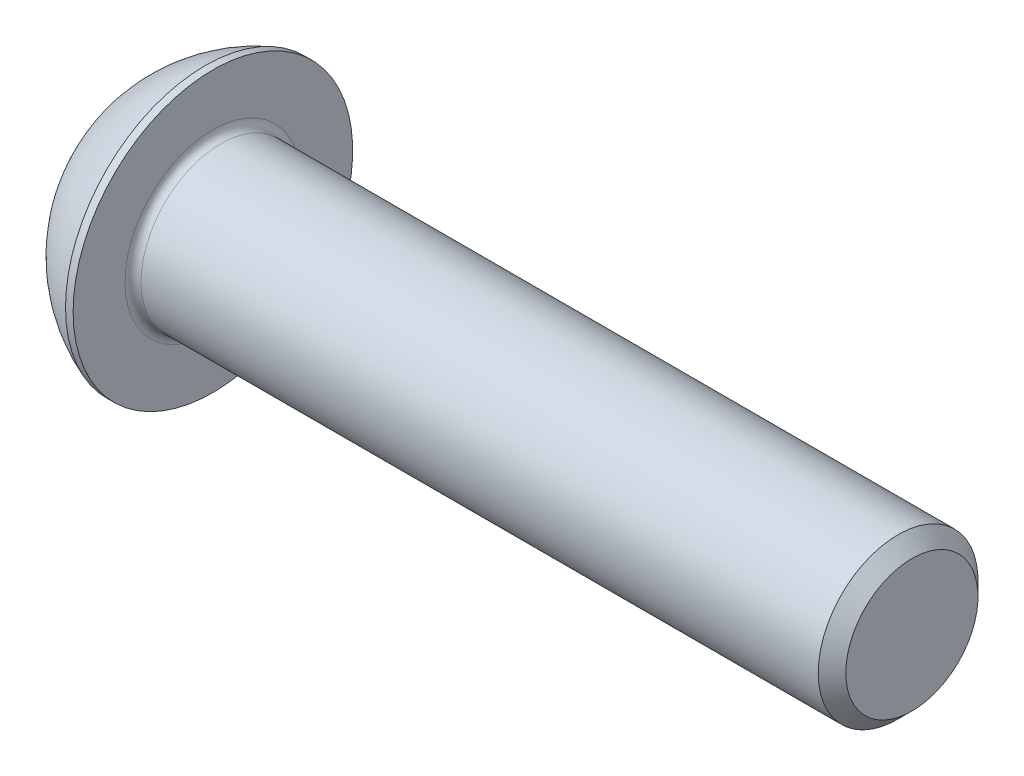
ISO-10303-21;
HEADER;
FILE_DESCRIPTION(('STEP AP214'),'2;1');
FILE_NAME('part.step','',(''),(''),'','','');
FILE_SCHEMA(('AUTOMOTIVE_DESIGN { 1 0 10303 214 1 1 1 1 }'));
ENDSEC;
DATA;
#1=APPLICATION_CONTEXT('core data for automotive mechanical design processes');
#2=APPLICATION_PROTOCOL_DEFINITION('international standard','automotive_design',2000,#1);
#3=PRODUCT_CONTEXT('',#1,'mechanical');
#4=PRODUCT('Part','Part','',(#3));
#5=PRODUCT_RELATED_PRODUCT_CATEGORY('part','',(#4));
#6=PRODUCT_DEFINITION_FORMATION('','',#4);
#7=PRODUCT_DEFINITION_CONTEXT('part definition',#1,'design');
#8=PRODUCT_DEFINITION('design','',#6,#7);
#9=PRODUCT_DEFINITION_SHAPE('','',#8);
#10=(LENGTH_UNIT() NAMED_UNIT(*) SI_UNIT(.MILLI.,.METRE.));
#11=(NAMED_UNIT(*) PLANE_ANGLE_UNIT() SI_UNIT($,.RADIAN.));
#12=(NAMED_UNIT(*) SI_UNIT($,.STERADIAN.) SOLID_ANGLE_UNIT());
#13=UNCERTAINTY_MEASURE_WITH_UNIT(LENGTH_MEASURE(1.E-05),#10,'distance_accuracy_value','');
#14=(GEOMETRIC_REPRESENTATION_CONTEXT(3) GLOBAL_UNCERTAINTY_ASSIGNED_CONTEXT((#13)) GLOBAL_UNIT_ASSIGNED_CONTEXT((#10,
#11,#12)) REPRESENTATION_CONTEXT('',''));
#15=CARTESIAN_POINT('',(0.,0.,0.));
#16=DIRECTION('',(0.,0.,1.));
#17=DIRECTION('',(1.,0.,0.));
#18=AXIS2_PLACEMENT_3D('',#15,#16,#17);
#19=CARTESIAN_POINT('',(0.,0.,0.));
#20=DIRECTION('',(-1.,0.,0.));
#21=DIRECTION('',(0.,0.,1.));
#22=AXIS2_PLACEMENT_3D('',#19,#20,#21);
#23=PLANE('',#22);
#24=CARTESIAN_POINT('',(0.,0.,0.));
#25=DIRECTION('',(-1.,0.,0.));
#26=DIRECTION('',(0.,0.,1.));
#27=AXIS2_PLACEMENT_3D('',#24,#25,#26);
#28=CIRCLE('',#27,3.5);
#29=CARTESIAN_POINT('',(0.,3.5,0.));
#30=VERTEX_POINT('',#29);
#31=EDGE_CURVE('E193',#30,#30,#28,.T.);
#32=ORIENTED_EDGE('',*,*,#31,.T.);
#33=EDGE_LOOP('',(#32));
#34=FACE_BOUND('',#33,.T.);
#35=DIRECTION('',(0.,-1.,0.));
#36=VECTOR('',#35,1.);
#37=CARTESIAN_POINT('',(0.,-1.44337567297406,2.5));
#38=LINE('',#37,#36);
#39=CARTESIAN_POINT('',(0.,1.44337567297406,2.5));
#40=VERTEX_POINT('',#39);
#41=CARTESIAN_POINT('',(0.,-1.44337567297406,2.5));
#42=VERTEX_POINT('',#41);
#43=EDGE_CURVE('E56',#40,#42,#38,.T.);
#44=ORIENTED_EDGE('',*,*,#43,.T.);
#45=DIRECTION('',(0.,-0.5,-0.866025403784439));
#46=VECTOR('',#45,1.);
#47=CARTESIAN_POINT('',(0.,-2.88675134594813,0.));
#48=LINE('',#47,#46);
#49=CARTESIAN_POINT('',(0.,-2.88675134594813,0.));
#50=VERTEX_POINT('',#49);
#51=EDGE_CURVE('E293',#42,#50,#48,.T.);
#52=ORIENTED_EDGE('',*,*,#51,.T.);
#53=DIRECTION('',(0.,0.5,-0.866025403784439));
#54=VECTOR('',#53,1.);
#55=CARTESIAN_POINT('',(0.,-1.44337567297406,-2.5));
#56=LINE('',#55,#54);
#57=CARTESIAN_POINT('',(0.,-1.44337567297406,-2.5));
#58=VERTEX_POINT('',#57);
#59=EDGE_CURVE('E160',#50,#58,#56,.T.);
#60=ORIENTED_EDGE('',*,*,#59,.T.);
#61=DIRECTION('',(0.,1.,0.));
#62=VECTOR('',#61,1.);
#63=CARTESIAN_POINT('',(0.,1.44337567297406,-2.5));
#64=LINE('',#63,#62);
#65=CARTESIAN_POINT('',(0.,1.44337567297406,-2.5));
#66=VERTEX_POINT('',#65);
#67=EDGE_CURVE('E298',#58,#66,#64,.T.);
#68=ORIENTED_EDGE('',*,*,#67,.T.);
#69=DIRECTION('',(0.,0.5,0.866025403784439));
#70=VECTOR('',#69,1.);
#71=CARTESIAN_POINT('',(0.,2.88675134594813,0.));
#72=LINE('',#71,#70);
#73=CARTESIAN_POINT('',(0.,2.88675134594813,0.));
#74=VERTEX_POINT('',#73);
#75=EDGE_CURVE('E301',#66,#74,#72,.T.);
#76=ORIENTED_EDGE('',*,*,#75,.T.);
#77=DIRECTION('',(0.,-0.5,0.866025403784439));
#78=VECTOR('',#77,1.);
#79=CARTESIAN_POINT('',(0.,1.44337567297406,2.5));
#80=LINE('',#79,#78);
#81=EDGE_CURVE('E304',#74,#40,#80,.T.);
#82=ORIENTED_EDGE('',*,*,#81,.T.);
#83=EDGE_LOOP('',(#44,#52,#60,#68,#76,#82));
#84=FACE_BOUND('',#83,.T.);
#85=ADVANCED_FACE('F38',(#34,#84),#23,.T.);
#86=CARTESIAN_POINT('',(6.58089552238806,0.,0.));
#87=DIRECTION('',(-1.,0.,0.));
#88=DIRECTION('',(0.,1.,0.));
#89=AXIS2_PLACEMENT_3D('',#86,#87,#88);
#90=SPHERICAL_SURFACE('',#89,7.45373637020972);
#91=CARTESIAN_POINT('',(4.02,0.,0.));
#92=DIRECTION('',(-1.,0.,0.));
#93=DIRECTION('',(0.,0.,1.));
#94=AXIS2_PLACEMENT_3D('',#91,#92,#93);
#95=CIRCLE('',#94,7.);
#96=CARTESIAN_POINT('',(4.02,7.,0.));
#97=VERTEX_POINT('',#96);
#98=EDGE_CURVE('E189',#97,#97,#95,.T.);
#99=CARTESIAN_POINT('',(4.02,7.,0.));
#100=CARTESIAN_POINT('',(3.96667727076465,6.98049242402172,0.));
#101=CARTESIAN_POINT('',(3.91357752864801,6.96037534487455,0.));
#102=CARTESIAN_POINT('',(3.8078515532553,6.91893318326458,0.));
#103=CARTESIAN_POINT('',(3.75522531997925,6.89760810080177,0.));
#104=CARTESIAN_POINT('',(3.65047389687093,6.85376093558268,0.));
#105=CARTESIAN_POINT('',(3.59834870703866,6.83123885282639,0.));
#106=CARTESIAN_POINT('',(3.49462657751034,6.7850094841704,0.));
#107=CARTESIAN_POINT('',(3.44302963781429,6.7613021982707,0.));
#108=CARTESIAN_POINT('',(3.34039095714278,6.71271479411965,0.));
#109=CARTESIAN_POINT('',(3.28934921616733,6.6878346758683,0.));
#110=CARTESIAN_POINT('',(3.18784758682982,6.63691460241549,0.));
#111=CARTESIAN_POINT('',(3.13738769846775,6.61087464721403,0.));
#112=CARTESIAN_POINT('',(3.03707612567073,6.55764849769805,0.));
#113=CARTESIAN_POINT('',(2.98722444123577,6.53046230338352,0.));
#114=CARTESIAN_POINT('',(2.88815530965033,6.47495787293607,0.));
#115=CARTESIAN_POINT('',(2.83893786249984,6.44663963680314,0.));
#116=CARTESIAN_POINT('',(2.74116290772229,6.38888591095228,0.));
#117=CARTESIAN_POINT('',(2.69260540009523,6.35945042123436,0.));
#118=CARTESIAN_POINT('',(2.59617568194692,6.29947755995902,0.));
#119=CARTESIAN_POINT('',(2.54830347142567,6.2689401884016,0.));
#120=CARTESIAN_POINT('',(2.45326934720369,6.20677951059818,0.));
#121=CARTESIAN_POINT('',(2.40610743350296,6.17515620435217,0.));
#122=CARTESIAN_POINT('',(2.31251853170541,6.1108401714212,0.));
#123=CARTESIAN_POINT('',(2.2660915436086,6.07814744473625,0.));
#124=CARTESIAN_POINT('',(2.17399673801164,6.01170964364606,0.));
#125=CARTESIAN_POINT('',(2.12832892051151,5.97796456924083,0.));
#126=CARTESIAN_POINT('',(2.03777630464825,5.90943969498364,0.));
#127=CARTESIAN_POINT('',(1.99289150628513,5.87465989513168,0.));
#128=CARTESIAN_POINT('',(1.90392836832988,5.80408373260638,0.));
#129=CARTESIAN_POINT('',(1.85985002873775,5.76828736993305,0.));
#130=CARTESIAN_POINT('',(1.77252282681141,5.69569677525744,0.));
#131=CARTESIAN_POINT('',(1.72927396447721,5.65890254325517,0.));
#132=CARTESIAN_POINT('',(1.64362830238603,5.58433542451906,0.));
#133=CARTESIAN_POINT('',(1.60123150262904,5.54656253778523,0.));
#134=CARTESIAN_POINT('',(1.51731210604947,5.4700578352542,0.));
#135=CARTESIAN_POINT('',(1.47578950922687,5.431326019457,0.));
#136=CARTESIAN_POINT('',(1.39364020234904,5.35292368523707,0.));
#137=CARTESIAN_POINT('',(1.35301349229381,5.31325316681434,0.));
#138=CARTESIAN_POINT('',(1.27267717493576,5.23299414398831,0.));
#139=CARTESIAN_POINT('',(1.23296756763295,5.19240563958501,0.));
#140=CARTESIAN_POINT('',(1.15448619283766,5.1103318408312,0.));
#141=CARTESIAN_POINT('',(1.11571442534517,5.0688465464807,0.));
#142=CARTESIAN_POINT('',(1.03912897747163,4.98500083218559,0.));
#143=CARTESIAN_POINT('',(1.00131529709057,4.94264041224098,0.));
#144=CARTESIAN_POINT('',(0.926665770412102,4.85706656811615,0.));
#145=CARTESIAN_POINT('',(0.889829924114693,4.81385314393593,0.));
#146=CARTESIAN_POINT('',(0.817155301929323,4.72659585815459,0.));
#147=CARTESIAN_POINT('',(0.781316526041362,4.68255199655347,0.));
#148=CARTESIAN_POINT('',(0.710654760328621,4.59365683640532,0.));
#149=CARTESIAN_POINT('',(0.675831770503841,4.54880553785828,0.));
#150=CARTESIAN_POINT('',(0.607219762051194,4.45831892598402,0.));
#151=CARTESIAN_POINT('',(0.573430743423327,4.41268361265678,0.));
#152=CARTESIAN_POINT('',(0.506904322758882,4.32065280269138,0.));
#153=CARTESIAN_POINT('',(0.474166920722303,4.27425730605322,0.));
#154=CARTESIAN_POINT('',(0.409760828646038,4.18073035837463,0.));
#155=CARTESIAN_POINT('',(0.378092138606353,4.1335989073342,0.));
#156=CARTESIAN_POINT('',(0.315840010874661,4.03862466237799,0.));
#157=CARTESIAN_POINT('',(0.285256573182655,3.99078186846222,0.));
#158=CARTESIAN_POINT('',(0.2251909123934,3.89440992714022,0.));
#159=CARTESIAN_POINT('',(0.195708689296152,3.84588077973399,0.));
#160=CARTESIAN_POINT('',(0.137860887287449,3.74816145542334,0.));
#161=CARTESIAN_POINT('',(0.109495308375993,3.69897127851891,0.));
#162=CARTESIAN_POINT('',(0.0538954828937631,3.59995565329748,0.));
#163=CARTESIAN_POINT('',(0.0266612363229892,3.55013020498047,0.));
#164=CARTESIAN_POINT('',(0.,3.5,0.));
#165=B_SPLINE_CURVE_WITH_KNOTS('',3,(#99,#100,#101,#102,#103,#104,#105,#106,#107,#108,#109,#110,
#111,#112,#113,#114,#115,#116,#117,#118,#119,#120,#121,#122,#123,#124,#125,#126,#127,#128,#129,
#130,#131,#132,#133,#134,#135,#136,#137,#138,#139,#140,#141,#142,#143,#144,#145,#146,#147,#148,
#149,#150,#151,#152,#153,#154,#155,#156,#157,#158,#159,#160,#161,#162,#163,#164),.UNSPECIFIED.,
.F.,.F.,(4,2,2,2,2,2,2,2,2,2,2,2,2,2,2,2,2,2,2,2,2,2,2,2,2,2,2,2,2,2,2,2,4),(0.,
0.170333394580244,0.340666789160486,0.511000183740729,0.681333578320973,0.851666972901215,
1.02200036748146,1.1923337620617,1.36266715664194,1.53300055122219,1.70333394580243,
1.87366734038267,2.04400073496292,2.21433412954316,2.3846675241234,2.55500091870365,
2.72533431328389,2.89566770786413,3.06600110244437,3.23633449702462,3.40666789160486,
3.5770012861851,3.74733468076535,3.91766807534559,4.08800146992583,4.25833486450607,
4.42866825908632,4.59900165366656,4.7693350482468,4.93966844282704,5.11000183740729,
5.28033523198753,5.45066862656777),.UNSPECIFIED.);
#166=EDGE_CURVE('BSEAM217',#97,#30,#165,.T.);
#167=ORIENTED_EDGE('',*,*,#98,.T.);
#168=ORIENTED_EDGE('',*,*,#31,.F.);
#169=ORIENTED_EDGE('',*,*,#166,.T.);
#170=ORIENTED_EDGE('',*,*,#166,.F.);
#171=EDGE_LOOP('',(#167,#169,#168,#170));
#172=FACE_BOUND('',#171,.T.);
#173=ADVANCED_FACE('F217',(#172),#90,.T.);
#174=CARTESIAN_POINT('',(0.,0.,0.));
#175=DIRECTION('',(-1.,0.,0.));
#176=DIRECTION('',(0.,0.,1.));
#177=AXIS2_PLACEMENT_3D('',#174,#175,#176);
#178=CYLINDRICAL_SURFACE('',#177,7.);
#179=ORIENTED_EDGE('',*,*,#98,.F.);
#180=EDGE_LOOP('',(#179));
#181=FACE_BOUND('',#180,.T.);
#182=CARTESIAN_POINT('',(4.4,0.,0.));
#183=DIRECTION('',(-1.,0.,0.));
#184=DIRECTION('',(0.,0.,1.));
#185=AXIS2_PLACEMENT_3D('',#182,#183,#184);
#186=CIRCLE('',#185,7.);
#187=CARTESIAN_POINT('',(4.4,0.,7.));
#188=VERTEX_POINT('',#187);
#189=EDGE_CURVE('E185',#188,#188,#186,.T.);
#190=ORIENTED_EDGE('',*,*,#189,.T.);
#191=EDGE_LOOP('',(#190));
#192=FACE_BOUND('',#191,.T.);
#193=ADVANCED_FACE('F222',(#181,#192),#178,.T.);
#194=CARTESIAN_POINT('',(4.4,4.,0.));
#195=DIRECTION('',(-1.,0.,0.));
#196=DIRECTION('',(0.,0.,1.));
#197=AXIS2_PLACEMENT_3D('',#194,#195,#196);
#198=PLANE('',#197);
#199=CARTESIAN_POINT('',(4.4,0.,0.));
#200=DIRECTION('',(-1.,0.,0.));
#201=DIRECTION('',(0.,0.,1.));
#202=AXIS2_PLACEMENT_3D('',#199,#200,#201);
#203=CIRCLE('',#202,4.4);
#204=CARTESIAN_POINT('',(4.4,0.,4.4));
#205=VERTEX_POINT('',#204);
#206=EDGE_CURVE('E47',#205,#205,#203,.T.);
#207=ORIENTED_EDGE('',*,*,#206,.T.);
#208=EDGE_LOOP('',(#207));
#209=FACE_BOUND('',#208,.T.);
#210=ORIENTED_EDGE('',*,*,#189,.F.);
#211=EDGE_LOOP('',(#210));
#212=FACE_BOUND('',#211,.T.);
#213=ADVANCED_FACE('F201',(#209,#212),#198,.F.);
#214=CARTESIAN_POINT('',(0.,0.,0.));
#215=DIRECTION('',(-1.,0.,0.));
#216=DIRECTION('',(0.,0.,1.));
#217=AXIS2_PLACEMENT_3D('',#214,#215,#216);
#218=CYLINDRICAL_SURFACE('',#217,4.);
#219=CARTESIAN_POINT('',(4.8,0.,0.));
#220=DIRECTION('',(-1.,0.,0.));
#221=DIRECTION('',(0.,0.,1.));
#222=AXIS2_PLACEMENT_3D('',#219,#220,#221);
#223=CIRCLE('',#222,4.);
#224=CARTESIAN_POINT('',(4.8,0.,4.));
#225=VERTEX_POINT('',#224);
#226=EDGE_CURVE('E11',#225,#225,#223,.F.);
#227=ORIENTED_EDGE('',*,*,#226,.T.);
#228=EDGE_LOOP('',(#227));
#229=FACE_BOUND('',#228,.T.);
#230=CARTESIAN_POINT('',(38.7095,0.,0.));
#231=DIRECTION('',(-1.,0.,0.));
#232=DIRECTION('',(0.,0.,1.));
#233=AXIS2_PLACEMENT_3D('',#230,#231,#232);
#234=CIRCLE('',#233,4.);
#235=CARTESIAN_POINT('',(38.7095,0.,4.));
#236=VERTEX_POINT('',#235);
#237=EDGE_CURVE('E181',#236,#236,#234,.T.);
#238=ORIENTED_EDGE('',*,*,#237,.T.);
#239=EDGE_LOOP('',(#238));
#240=FACE_BOUND('',#239,.T.);
#241=ADVANCED_FACE('F231',(#229,#240),#218,.T.);
#242=CARTESIAN_POINT('',(39.4,0.,0.));
#243=DIRECTION('',(-1.,0.,0.));
#244=DIRECTION('',(0.,0.,1.));
#245=AXIS2_PLACEMENT_3D('',#242,#243,#244);
#246=CONICAL_SURFACE('',#245,3.3095,0.785398163397442);
#247=ORIENTED_EDGE('',*,*,#237,.F.);
#248=EDGE_LOOP('',(#247));
#249=FACE_BOUND('',#248,.T.);
#250=CARTESIAN_POINT('',(39.4,0.,0.));
#251=DIRECTION('',(-1.,0.,0.));
#252=DIRECTION('',(0.,0.,1.));
#253=AXIS2_PLACEMENT_3D('',#250,#251,#252);
#254=CIRCLE('',#253,3.3095);
#255=CARTESIAN_POINT('',(39.4,0.,3.3095));
#256=VERTEX_POINT('',#255);
#257=EDGE_CURVE('E176',#256,#256,#254,.T.);
#258=ORIENTED_EDGE('',*,*,#257,.T.);
#259=EDGE_LOOP('',(#258));
#260=FACE_BOUND('',#259,.T.);
#261=ADVANCED_FACE('F212',(#249,#260),#246,.T.);
#262=CARTESIAN_POINT('',(39.4,0.,0.));
#263=DIRECTION('',(-1.,0.,0.));
#264=DIRECTION('',(0.,0.,1.));
#265=AXIS2_PLACEMENT_3D('',#262,#263,#264);
#266=PLANE('',#265);
#267=ORIENTED_EDGE('',*,*,#257,.F.);
#268=EDGE_LOOP('',(#267));
#269=FACE_BOUND('',#268,.T.);
#270=ADVANCED_FACE('F205',(#269),#266,.F.);
#271=CARTESIAN_POINT('',(4.8,0.,0.));
#272=DIRECTION('',(-1.,0.,0.));
#273=DIRECTION('',(0.,0.,1.));
#274=AXIS2_PLACEMENT_3D('',#271,#272,#273);
#275=TOROIDAL_SURFACE('',#274,4.4,0.4);
#276=ORIENTED_EDGE('',*,*,#226,.F.);
#277=EDGE_LOOP('',(#276));
#278=FACE_BOUND('',#277,.T.);
#279=ORIENTED_EDGE('',*,*,#206,.F.);
#280=EDGE_LOOP('',(#279));
#281=FACE_BOUND('',#280,.T.);
#282=ADVANCED_FACE('F40',(#278,#281),#275,.F.);
#283=CARTESIAN_POINT('',(2.6,-2.88675134594813,0.));
#284=DIRECTION('',(0.,0.866025403784439,-0.5));
#285=DIRECTION('',(0.,0.5,0.866025403784439));
#286=AXIS2_PLACEMENT_3D('',#283,#284,#285);
#287=PLANE('',#286);
#288=DIRECTION('',(0.,-0.5,-0.866025403784439));
#289=VECTOR('',#288,1.);
#290=CARTESIAN_POINT('',(2.6,-2.88675134594813,0.));
#291=LINE('',#290,#289);
#292=CARTESIAN_POINT('',(2.6,-1.44337567297406,2.5));
#293=VERTEX_POINT('',#292);
#294=CARTESIAN_POINT('',(2.6,-2.1650635094611,1.25));
#295=VERTEX_POINT('',#294);
#296=EDGE_CURVE('E141',#293,#295,#291,.T.);
#297=ORIENTED_EDGE('',*,*,#296,.T.);
#298=CARTESIAN_POINT('',(2.6,-2.88675134594813,0.));
#299=VERTEX_POINT('',#298);
#300=EDGE_CURVE('E134',#295,#299,#291,.T.);
#301=ORIENTED_EDGE('',*,*,#300,.T.);
#302=DIRECTION('',(-1.,0.,0.));
#303=VECTOR('',#302,1.);
#304=CARTESIAN_POINT('',(2.6,-2.88675134594813,0.));
#305=LINE('',#304,#303);
#306=EDGE_CURVE('E138',#299,#50,#305,.T.);
#307=ORIENTED_EDGE('',*,*,#306,.T.);
#308=ORIENTED_EDGE('',*,*,#51,.F.);
#309=DIRECTION('',(-1.,0.,0.));
#310=VECTOR('',#309,1.);
#311=CARTESIAN_POINT('',(2.6,-1.44337567297406,2.5));
#312=LINE('',#311,#310);
#313=EDGE_CURVE('E280',#293,#42,#312,.T.);
#314=ORIENTED_EDGE('',*,*,#313,.F.);
#315=EDGE_LOOP('',(#297,#301,#307,#308,#314));
#316=FACE_BOUND('',#315,.T.);
#317=ADVANCED_FACE('F136',(#316),#287,.T.);
#318=CARTESIAN_POINT('',(2.6,-1.44337567297406,-2.5));
#319=DIRECTION('',(0.,0.866025403784439,0.5));
#320=DIRECTION('',(0.,-0.5,0.866025403784439));
#321=AXIS2_PLACEMENT_3D('',#318,#319,#320);
#322=PLANE('',#321);
#323=DIRECTION('',(0.,0.5,-0.866025403784439));
#324=VECTOR('',#323,1.);
#325=CARTESIAN_POINT('',(2.6,-1.44337567297406,-2.5));
#326=LINE('',#325,#324);
#327=CARTESIAN_POINT('',(2.6,-2.1650635094611,-1.25));
#328=VERTEX_POINT('',#327);
#329=EDGE_CURVE('E147',#299,#328,#326,.T.);
#330=ORIENTED_EDGE('',*,*,#329,.T.);
#331=CARTESIAN_POINT('',(2.6,-1.44337567297406,-2.5));
#332=VERTEX_POINT('',#331);
#333=EDGE_CURVE('E155',#328,#332,#326,.T.);
#334=ORIENTED_EDGE('',*,*,#333,.T.);
#335=DIRECTION('',(-1.,0.,0.));
#336=VECTOR('',#335,1.);
#337=CARTESIAN_POINT('',(2.6,-1.44337567297406,-2.5));
#338=LINE('',#337,#336);
#339=EDGE_CURVE('E163',#332,#58,#338,.T.);
#340=ORIENTED_EDGE('',*,*,#339,.T.);
#341=ORIENTED_EDGE('',*,*,#59,.F.);
#342=ORIENTED_EDGE('',*,*,#306,.F.);
#343=EDGE_LOOP('',(#330,#334,#340,#341,#342));
#344=FACE_BOUND('',#343,.T.);
#345=ADVANCED_FACE('F158',(#344),#322,.T.);
#346=CARTESIAN_POINT('',(2.6,1.44337567297406,-2.5));
#347=DIRECTION('',(0.,0.,1.));
#348=DIRECTION('',(0.,-1.,0.));
#349=AXIS2_PLACEMENT_3D('',#346,#347,#348);
#350=PLANE('',#349);
#351=DIRECTION('',(0.,1.,0.));
#352=VECTOR('',#351,1.);
#353=CARTESIAN_POINT('',(2.6,1.44337567297406,-2.5));
#354=LINE('',#353,#352);
#355=CARTESIAN_POINT('',(2.6,0.,-2.5));
#356=VERTEX_POINT('',#355);
#357=EDGE_CURVE('E329',#332,#356,#354,.T.);
#358=ORIENTED_EDGE('',*,*,#357,.T.);
#359=CARTESIAN_POINT('',(2.6,1.44337567297406,-2.5));
#360=VERTEX_POINT('',#359);
#361=EDGE_CURVE('E154',#356,#360,#354,.T.);
#362=ORIENTED_EDGE('',*,*,#361,.T.);
#363=DIRECTION('',(-1.,0.,0.));
#364=VECTOR('',#363,1.);
#365=CARTESIAN_POINT('',(2.6,1.44337567297406,-2.5));
#366=LINE('',#365,#364);
#367=EDGE_CURVE('E170',#360,#66,#366,.T.);
#368=ORIENTED_EDGE('',*,*,#367,.T.);
#369=ORIENTED_EDGE('',*,*,#67,.F.);
#370=ORIENTED_EDGE('',*,*,#339,.F.);
#371=EDGE_LOOP('',(#358,#362,#368,#369,#370));
#372=FACE_BOUND('',#371,.T.);
#373=ADVANCED_FACE('F245',(#372),#350,.T.);
#374=CARTESIAN_POINT('',(2.6,2.88675134594813,0.));
#375=DIRECTION('',(0.,-0.866025403784439,0.5));
#376=DIRECTION('',(0.,-0.5,-0.866025403784439));
#377=AXIS2_PLACEMENT_3D('',#374,#375,#376);
#378=PLANE('',#377);
#379=DIRECTION('',(0.,0.5,0.866025403784439));
#380=VECTOR('',#379,1.);
#381=CARTESIAN_POINT('',(2.6,2.88675134594813,0.));
#382=LINE('',#381,#380);
#383=CARTESIAN_POINT('',(2.6,2.1650635094611,-1.25));
#384=VERTEX_POINT('',#383);
#385=EDGE_CURVE('E338',#360,#384,#382,.T.);
#386=ORIENTED_EDGE('',*,*,#385,.T.);
#387=CARTESIAN_POINT('',(2.6,2.88675134594813,0.));
#388=VERTEX_POINT('',#387);
#389=EDGE_CURVE('E334',#384,#388,#382,.T.);
#390=ORIENTED_EDGE('',*,*,#389,.T.);
#391=DIRECTION('',(-1.,0.,0.));
#392=VECTOR('',#391,1.);
#393=CARTESIAN_POINT('',(2.6,2.88675134594813,0.));
#394=LINE('',#393,#392);
#395=EDGE_CURVE('E312',#388,#74,#394,.T.);
#396=ORIENTED_EDGE('',*,*,#395,.T.);
#397=ORIENTED_EDGE('',*,*,#75,.F.);
#398=ORIENTED_EDGE('',*,*,#367,.F.);
#399=EDGE_LOOP('',(#386,#390,#396,#397,#398));
#400=FACE_BOUND('',#399,.T.);
#401=ADVANCED_FACE('F248',(#400),#378,.T.);
#402=CARTESIAN_POINT('',(2.6,1.44337567297406,2.5));
#403=DIRECTION('',(0.,-0.866025403784439,-0.5));
#404=DIRECTION('',(0.,0.5,-0.866025403784439));
#405=AXIS2_PLACEMENT_3D('',#402,#403,#404);
#406=PLANE('',#405);
#407=DIRECTION('',(0.,-0.5,0.866025403784439));
#408=VECTOR('',#407,1.);
#409=CARTESIAN_POINT('',(2.6,1.44337567297406,2.5));
#410=LINE('',#409,#408);
#411=CARTESIAN_POINT('',(2.6,2.1650635094611,1.25));
#412=VERTEX_POINT('',#411);
#413=EDGE_CURVE('E289',#388,#412,#410,.T.);
#414=ORIENTED_EDGE('',*,*,#413,.T.);
#415=CARTESIAN_POINT('',(2.6,1.44337567297406,2.5));
#416=VERTEX_POINT('',#415);
#417=EDGE_CURVE('E277',#412,#416,#410,.T.);
#418=ORIENTED_EDGE('',*,*,#417,.T.);
#419=DIRECTION('',(-1.,0.,0.));
#420=VECTOR('',#419,1.);
#421=CARTESIAN_POINT('',(2.6,1.44337567297406,2.5));
#422=LINE('',#421,#420);
#423=EDGE_CURVE('E287',#416,#40,#422,.T.);
#424=ORIENTED_EDGE('',*,*,#423,.T.);
#425=ORIENTED_EDGE('',*,*,#81,.F.);
#426=ORIENTED_EDGE('',*,*,#395,.F.);
#427=EDGE_LOOP('',(#414,#418,#424,#425,#426));
#428=FACE_BOUND('',#427,.T.);
#429=ADVANCED_FACE('F252',(#428),#406,.T.);
#430=CARTESIAN_POINT('',(2.6,-1.44337567297406,2.5));
#431=DIRECTION('',(0.,0.,-1.));
#432=DIRECTION('',(-1.,0.,0.));
#433=AXIS2_PLACEMENT_3D('',#430,#431,#432);
#434=PLANE('',#433);
#435=DIRECTION('',(0.,-1.,0.));
#436=VECTOR('',#435,1.);
#437=CARTESIAN_POINT('',(2.6,-1.44337567297406,2.5));
#438=LINE('',#437,#436);
#439=CARTESIAN_POINT('',(2.6,0.,2.5));
#440=VERTEX_POINT('',#439);
#441=EDGE_CURVE('E67',#416,#440,#438,.T.);
#442=ORIENTED_EDGE('',*,*,#441,.T.);
#443=EDGE_CURVE('E281',#440,#293,#438,.T.);
#444=ORIENTED_EDGE('',*,*,#443,.T.);
#445=ORIENTED_EDGE('',*,*,#313,.T.);
#446=ORIENTED_EDGE('',*,*,#43,.F.);
#447=ORIENTED_EDGE('',*,*,#423,.F.);
#448=EDGE_LOOP('',(#442,#444,#445,#446,#447));
#449=FACE_BOUND('',#448,.T.);
#450=ADVANCED_FACE('F256',(#449),#434,.T.);
#451=CARTESIAN_POINT('',(2.6,0.,5.));
#452=DIRECTION('',(-1.,0.,0.));
#453=DIRECTION('',(0.,0.,1.));
#454=AXIS2_PLACEMENT_3D('',#451,#452,#453);
#455=PLANE('',#454);
#456=ORIENTED_EDGE('',*,*,#441,.F.);
#457=ORIENTED_EDGE('',*,*,#417,.F.);
#458=CARTESIAN_POINT('',(2.6,0.,0.));
#459=DIRECTION('',(-1.,0.,0.));
#460=DIRECTION('',(0.,0.,1.));
#461=AXIS2_PLACEMENT_3D('',#458,#459,#460);
#462=CIRCLE('',#461,2.5);
#463=EDGE_CURVE('E168',#440,#412,#462,.T.);
#464=ORIENTED_EDGE('',*,*,#463,.F.);
#465=EDGE_LOOP('',(#456,#457,#464));
#466=FACE_BOUND('',#465,.T.);
#467=ADVANCED_FACE('F260',(#466),#455,.T.);
#468=ORIENTED_EDGE('',*,*,#413,.F.);
#469=ORIENTED_EDGE('',*,*,#389,.F.);
#470=EDGE_CURVE('E177',#412,#384,#462,.T.);
#471=ORIENTED_EDGE('',*,*,#470,.F.);
#472=EDGE_LOOP('',(#468,#469,#471));
#473=FACE_BOUND('',#472,.T.);
#474=ADVANCED_FACE('F268',(#473),#455,.T.);
#475=ORIENTED_EDGE('',*,*,#385,.F.);
#476=ORIENTED_EDGE('',*,*,#361,.F.);
#477=EDGE_CURVE('E348',#384,#356,#462,.T.);
#478=ORIENTED_EDGE('',*,*,#477,.F.);
#479=EDGE_LOOP('',(#475,#476,#478));
#480=FACE_BOUND('',#479,.T.);
#481=ADVANCED_FACE('F273',(#480),#455,.T.);
#482=ORIENTED_EDGE('',*,*,#357,.F.);
#483=ORIENTED_EDGE('',*,*,#333,.F.);
#484=EDGE_CURVE('E332',#356,#328,#462,.T.);
#485=ORIENTED_EDGE('',*,*,#484,.F.);
#486=EDGE_LOOP('',(#482,#483,#485));
#487=FACE_BOUND('',#486,.T.);
#488=ADVANCED_FACE('F266',(#487),#455,.T.);
#489=ORIENTED_EDGE('',*,*,#329,.F.);
#490=ORIENTED_EDGE('',*,*,#300,.F.);
#491=EDGE_CURVE('E149',#328,#295,#462,.T.);
#492=ORIENTED_EDGE('',*,*,#491,.F.);
#493=EDGE_LOOP('',(#489,#490,#492));
#494=FACE_BOUND('',#493,.T.);
#495=ADVANCED_FACE('F148',(#494),#455,.T.);
#496=ORIENTED_EDGE('',*,*,#296,.F.);
#497=ORIENTED_EDGE('',*,*,#443,.F.);
#498=EDGE_CURVE('E162',#295,#440,#462,.T.);
#499=ORIENTED_EDGE('',*,*,#498,.F.);
#500=EDGE_LOOP('',(#496,#497,#499));
#501=FACE_BOUND('',#500,.T.);
#502=ADVANCED_FACE('F240',(#501),#455,.T.);
#503=CARTESIAN_POINT('',(4.04337567297408,0.,0.));
#504=DIRECTION('',(-1.,0.,0.));
#505=DIRECTION('',(0.,0.,1.));
#506=AXIS2_PLACEMENT_3D('',#503,#504,#505);
#507=CONICAL_SURFACE('',#506,0.,1.04719755119659);
#508=ORIENTED_EDGE('',*,*,#463,.T.);
#509=ORIENTED_EDGE('',*,*,#470,.T.);
#510=ORIENTED_EDGE('',*,*,#477,.T.);
#511=ORIENTED_EDGE('',*,*,#484,.T.);
#512=ORIENTED_EDGE('',*,*,#491,.T.);
#513=ORIENTED_EDGE('',*,*,#498,.T.);
#514=EDGE_LOOP('',(#508,#509,#510,#511,#512,#513));
#515=FACE_BOUND('',#514,.T.);
#516=CARTESIAN_POINT('',(4.04337567297408,0.,0.));
#517=VERTEX_POINT('',#516);
#518=VERTEX_LOOP('',#517);
#519=FACE_BOUND('',#518,.T.);
#520=ADVANCED_FACE('F238',(#515,#519),#507,.F.);
#521=CLOSED_SHELL('',(#85,#173,#193,#213,#241,#261,#270,#282,#317,#345,#373,#401,#429,#450,#467,
#474,#481,#488,#495,#502,#520));
#522=MANIFOLD_SOLID_BREP('B2',#521);
#523=ADVANCED_BREP_SHAPE_REPRESENTATION('',(#18,#522),#14);
#524=SHAPE_DEFINITION_REPRESENTATION(#9,#523);
ENDSEC;
END-ISO-10303-21;
